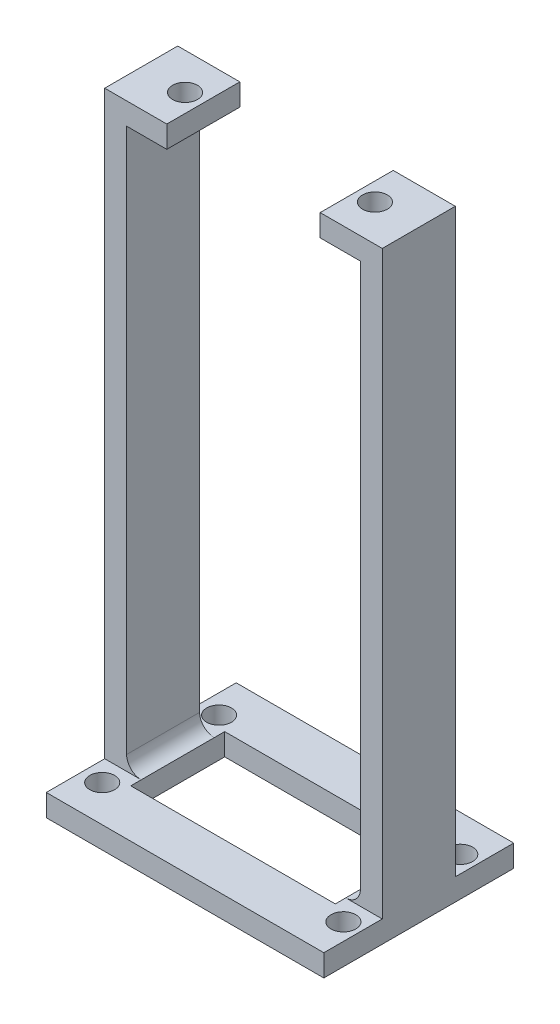
ISO-10303-21;
HEADER;
FILE_DESCRIPTION(('STEP AP214'),'2;1');
FILE_NAME('part.step','',(''),(''),'','','');
FILE_SCHEMA(('AUTOMOTIVE_DESIGN { 1 0 10303 214 1 1 1 1 }'));
ENDSEC;
DATA;
#1=APPLICATION_CONTEXT('core data for automotive mechanical design processes');
#2=APPLICATION_PROTOCOL_DEFINITION('international standard','automotive_design',2000,#1);
#3=PRODUCT_CONTEXT('',#1,'mechanical');
#4=PRODUCT('Part','Part','',(#3));
#5=PRODUCT_RELATED_PRODUCT_CATEGORY('part','',(#4));
#6=PRODUCT_DEFINITION_FORMATION('','',#4);
#7=PRODUCT_DEFINITION_CONTEXT('part definition',#1,'design');
#8=PRODUCT_DEFINITION('design','',#6,#7);
#9=PRODUCT_DEFINITION_SHAPE('','',#8);
#10=(LENGTH_UNIT() NAMED_UNIT(*) SI_UNIT(.MILLI.,.METRE.));
#11=(NAMED_UNIT(*) PLANE_ANGLE_UNIT() SI_UNIT($,.RADIAN.));
#12=(NAMED_UNIT(*) SI_UNIT($,.STERADIAN.) SOLID_ANGLE_UNIT());
#13=UNCERTAINTY_MEASURE_WITH_UNIT(LENGTH_MEASURE(1.E-05),#10,'distance_accuracy_value','');
#14=(GEOMETRIC_REPRESENTATION_CONTEXT(3) GLOBAL_UNCERTAINTY_ASSIGNED_CONTEXT((#13)) GLOBAL_UNIT_ASSIGNED_CONTEXT((#10,
#11,#12)) REPRESENTATION_CONTEXT('',''));
#15=CARTESIAN_POINT('',(0.,0.,0.));
#16=DIRECTION('',(0.,0.,1.));
#17=DIRECTION('',(1.,0.,0.));
#18=AXIS2_PLACEMENT_3D('',#15,#16,#17);
#19=CARTESIAN_POINT('',(-16.,0.,-5.));
#20=DIRECTION('',(0.,1.,0.));
#21=DIRECTION('',(-1.,0.,0.));
#22=AXIS2_PLACEMENT_3D('',#19,#20,#21);
#23=PLANE('',#22);
#24=DIRECTION('',(0.,0.,-1.));
#25=VECTOR('',#24,1.);
#26=CARTESIAN_POINT('',(-14.,0.,6.43055637719667));
#27=LINE('',#26,#25);
#28=CARTESIAN_POINT('',(-14.,0.,6.43055637719667));
#29=VERTEX_POINT('',#28);
#30=CARTESIAN_POINT('',(-14.,0.,5.));
#31=VERTEX_POINT('',#30);
#32=EDGE_CURVE('E207',#29,#31,#27,.T.);
#33=ORIENTED_EDGE('',*,*,#32,.T.);
#34=DIRECTION('',(1.,0.,0.));
#35=VECTOR('',#34,1.);
#36=CARTESIAN_POINT('',(0.,0.,5.));
#37=LINE('',#36,#35);
#38=CARTESIAN_POINT('',(-19.,0.,5.));
#39=VERTEX_POINT('',#38);
#40=EDGE_CURVE('E448',#39,#31,#37,.T.);
#41=ORIENTED_EDGE('',*,*,#40,.F.);
#42=DIRECTION('',(0.,0.,-1.));
#43=VECTOR('',#42,1.);
#44=CARTESIAN_POINT('',(-19.,0.,13.));
#45=LINE('',#44,#43);
#46=CARTESIAN_POINT('',(-19.,0.,13.));
#47=VERTEX_POINT('',#46);
#48=EDGE_CURVE('E305',#47,#39,#45,.T.);
#49=ORIENTED_EDGE('',*,*,#48,.F.);
#50=DIRECTION('',(-1.,0.,0.));
#51=VECTOR('',#50,1.);
#52=CARTESIAN_POINT('',(-19.,0.,13.));
#53=LINE('',#52,#51);
#54=CARTESIAN_POINT('',(19.,0.,13.));
#55=VERTEX_POINT('',#54);
#56=EDGE_CURVE('E299',#55,#47,#53,.T.);
#57=ORIENTED_EDGE('',*,*,#56,.F.);
#58=DIRECTION('',(0.,0.,1.));
#59=VECTOR('',#58,1.);
#60=CARTESIAN_POINT('',(19.,0.,13.));
#61=LINE('',#60,#59);
#62=CARTESIAN_POINT('',(19.,0.,5.));
#63=VERTEX_POINT('',#62);
#64=EDGE_CURVE('E300',#63,#55,#61,.T.);
#65=ORIENTED_EDGE('',*,*,#64,.F.);
#66=CARTESIAN_POINT('',(14.,0.,5.));
#67=VERTEX_POINT('',#66);
#68=EDGE_CURVE('E417',#67,#63,#37,.T.);
#69=ORIENTED_EDGE('',*,*,#68,.F.);
#70=DIRECTION('',(0.,0.,1.));
#71=VECTOR('',#70,1.);
#72=CARTESIAN_POINT('',(14.,0.,6.43055637719668));
#73=LINE('',#72,#71);
#74=CARTESIAN_POINT('',(14.,0.,6.43055637719668));
#75=VERTEX_POINT('',#74);
#76=EDGE_CURVE('E206',#67,#75,#73,.T.);
#77=ORIENTED_EDGE('',*,*,#76,.T.);
#78=DIRECTION('',(-1.,0.,0.));
#79=VECTOR('',#78,1.);
#80=CARTESIAN_POINT('',(14.,0.,6.43055637719668));
#81=LINE('',#80,#79);
#82=EDGE_CURVE('E197',#75,#29,#81,.T.);
#83=ORIENTED_EDGE('',*,*,#82,.T.);
#84=EDGE_LOOP('',(#33,#41,#49,#57,#65,#69,#77,#83));
#85=FACE_BOUND('',#84,.T.);
#86=CARTESIAN_POINT('',(-16.3408584723591,0.,8.00000000000001));
#87=DIRECTION('',(0.,1.,0.));
#88=DIRECTION('',(0.,0.,1.));
#89=AXIS2_PLACEMENT_3D('',#86,#87,#88);
#90=CIRCLE('',#89,1.7);
#91=CARTESIAN_POINT('',(-16.3408584723591,0.,9.7));
#92=VERTEX_POINT('',#91);
#93=EDGE_CURVE('E254',#92,#92,#90,.T.);
#94=ORIENTED_EDGE('',*,*,#93,.F.);
#95=EDGE_LOOP('',(#94));
#96=FACE_BOUND('',#95,.T.);
#97=CARTESIAN_POINT('',(16.6799683758061,0.,8.));
#98=DIRECTION('',(0.,1.,0.));
#99=DIRECTION('',(0.,0.,1.));
#100=AXIS2_PLACEMENT_3D('',#97,#98,#99);
#101=CIRCLE('',#100,1.7);
#102=CARTESIAN_POINT('',(16.6799683758061,0.,9.7));
#103=VERTEX_POINT('',#102);
#104=EDGE_CURVE('E241',#103,#103,#101,.T.);
#105=ORIENTED_EDGE('',*,*,#104,.F.);
#106=EDGE_LOOP('',(#105));
#107=FACE_BOUND('',#106,.T.);
#108=ADVANCED_FACE('F39',(#85,#96,#107),#23,.T.);
#109=CARTESIAN_POINT('',(0.,0.,-5.));
#110=DIRECTION('',(0.,0.,1.));
#111=DIRECTION('',(1.,0.,0.));
#112=AXIS2_PLACEMENT_3D('',#109,#110,#111);
#113=PLANE('',#112);
#114=DIRECTION('',(1.,0.,0.));
#115=VECTOR('',#114,1.);
#116=CARTESIAN_POINT('',(0.,0.,-5.));
#117=LINE('',#116,#115);
#118=CARTESIAN_POINT('',(-19.,0.,-5.));
#119=VERTEX_POINT('',#118);
#120=CARTESIAN_POINT('',(-14.,0.,-5.));
#121=VERTEX_POINT('',#120);
#122=EDGE_CURVE('E212',#119,#121,#117,.T.);
#123=ORIENTED_EDGE('',*,*,#122,.F.);
#124=DIRECTION('',(0.,-1.,0.));
#125=VECTOR('',#124,1.);
#126=CARTESIAN_POINT('',(-19.,79.5,-5.));
#127=LINE('',#126,#125);
#128=CARTESIAN_POINT('',(-19.,79.5,-5.));
#129=VERTEX_POINT('',#128);
#130=EDGE_CURVE('E380',#129,#119,#127,.T.);
#131=ORIENTED_EDGE('',*,*,#130,.F.);
#132=DIRECTION('',(-1.,0.,0.));
#133=VECTOR('',#132,1.);
#134=CARTESIAN_POINT('',(-10.5000000000001,79.5,-5.));
#135=LINE('',#134,#133);
#136=CARTESIAN_POINT('',(-10.5000000000001,79.5,-5.));
#137=VERTEX_POINT('',#136);
#138=EDGE_CURVE('E376',#137,#129,#135,.T.);
#139=ORIENTED_EDGE('',*,*,#138,.F.);
#140=DIRECTION('',(0.,1.,0.));
#141=VECTOR('',#140,1.);
#142=CARTESIAN_POINT('',(-10.5000000000001,79.5,-5.));
#143=LINE('',#142,#141);
#144=CARTESIAN_POINT('',(-10.5000000000001,76.5,-5.));
#145=VERTEX_POINT('',#144);
#146=EDGE_CURVE('E409',#145,#137,#143,.T.);
#147=ORIENTED_EDGE('',*,*,#146,.F.);
#148=DIRECTION('',(1.,0.,0.));
#149=VECTOR('',#148,1.);
#150=CARTESIAN_POINT('',(-10.5000000000001,76.5,-5.));
#151=LINE('',#150,#149);
#152=CARTESIAN_POINT('',(-16.0000000000001,76.5,-5.));
#153=VERTEX_POINT('',#152);
#154=EDGE_CURVE('E405',#153,#145,#151,.T.);
#155=ORIENTED_EDGE('',*,*,#154,.F.);
#156=DIRECTION('',(0.,1.,0.));
#157=VECTOR('',#156,1.);
#158=CARTESIAN_POINT('',(-16.0000000000001,76.5,-5.));
#159=LINE('',#158,#157);
#160=CARTESIAN_POINT('',(-16.,2.,-5.));
#161=VERTEX_POINT('',#160);
#162=EDGE_CURVE('E402',#161,#153,#159,.T.);
#163=ORIENTED_EDGE('',*,*,#162,.F.);
#164=CARTESIAN_POINT('',(-14.,2.,-5.));
#165=DIRECTION('',(0.,0.,1.));
#166=DIRECTION('',(1.,0.,0.));
#167=AXIS2_PLACEMENT_3D('',#164,#165,#166);
#168=CIRCLE('',#167,2.);
#169=EDGE_CURVE('E465',#161,#121,#168,.T.);
#170=ORIENTED_EDGE('',*,*,#169,.T.);
#171=EDGE_LOOP('',(#123,#131,#139,#147,#155,#163,#170));
#172=FACE_BOUND('',#171,.T.);
#173=ADVANCED_FACE('F511',(#172),#113,.F.);
#174=CARTESIAN_POINT('',(14.,0.,-5.));
#175=VERTEX_POINT('',#174);
#176=CARTESIAN_POINT('',(19.,0.,-5.));
#177=VERTEX_POINT('',#176);
#178=EDGE_CURVE('E325',#175,#177,#117,.T.);
#179=ORIENTED_EDGE('',*,*,#178,.F.);
#180=CARTESIAN_POINT('',(14.,2.00000000000001,-5.));
#181=DIRECTION('',(0.,0.,1.));
#182=DIRECTION('',(1.,0.,0.));
#183=AXIS2_PLACEMENT_3D('',#180,#181,#182);
#184=CIRCLE('',#183,2.);
#185=CARTESIAN_POINT('',(16.,2.00000000000001,-5.));
#186=VERTEX_POINT('',#185);
#187=EDGE_CURVE('E11',#175,#186,#184,.T.);
#188=ORIENTED_EDGE('',*,*,#187,.T.);
#189=DIRECTION('',(0.,-1.,0.));
#190=VECTOR('',#189,1.);
#191=CARTESIAN_POINT('',(16.,0.,-5.));
#192=LINE('',#191,#190);
#193=CARTESIAN_POINT('',(16.,76.5,-5.));
#194=VERTEX_POINT('',#193);
#195=EDGE_CURVE('E399',#194,#186,#192,.T.);
#196=ORIENTED_EDGE('',*,*,#195,.F.);
#197=DIRECTION('',(1.,0.,0.));
#198=VECTOR('',#197,1.);
#199=CARTESIAN_POINT('',(16.,76.5,-5.));
#200=LINE('',#199,#198);
#201=CARTESIAN_POINT('',(10.5,76.5,-5.));
#202=VERTEX_POINT('',#201);
#203=EDGE_CURVE('E395',#202,#194,#200,.T.);
#204=ORIENTED_EDGE('',*,*,#203,.F.);
#205=DIRECTION('',(0.,-1.,0.));
#206=VECTOR('',#205,1.);
#207=CARTESIAN_POINT('',(10.5,79.5,-5.));
#208=LINE('',#207,#206);
#209=CARTESIAN_POINT('',(10.5,79.5,-5.));
#210=VERTEX_POINT('',#209);
#211=EDGE_CURVE('E391',#210,#202,#208,.T.);
#212=ORIENTED_EDGE('',*,*,#211,.F.);
#213=DIRECTION('',(-1.,0.,0.));
#214=VECTOR('',#213,1.);
#215=CARTESIAN_POINT('',(19.,79.5,-5.));
#216=LINE('',#215,#214);
#217=CARTESIAN_POINT('',(19.,79.5,-5.));
#218=VERTEX_POINT('',#217);
#219=EDGE_CURVE('E387',#218,#210,#216,.T.);
#220=ORIENTED_EDGE('',*,*,#219,.F.);
#221=DIRECTION('',(0.,1.,0.));
#222=VECTOR('',#221,1.);
#223=CARTESIAN_POINT('',(19.,79.5,-5.));
#224=LINE('',#223,#222);
#225=EDGE_CURVE('E384',#177,#218,#224,.T.);
#226=ORIENTED_EDGE('',*,*,#225,.F.);
#227=EDGE_LOOP('',(#179,#188,#196,#204,#212,#220,#226));
#228=FACE_BOUND('',#227,.T.);
#229=ADVANCED_FACE('F482',(#228),#113,.F.);
#230=CARTESIAN_POINT('',(0.,0.,5.));
#231=DIRECTION('',(0.,0.,1.));
#232=DIRECTION('',(1.,0.,0.));
#233=AXIS2_PLACEMENT_3D('',#230,#231,#232);
#234=PLANE('',#233);
#235=DIRECTION('',(0.,-1.,0.));
#236=VECTOR('',#235,1.);
#237=CARTESIAN_POINT('',(-19.,79.5,5.));
#238=LINE('',#237,#236);
#239=CARTESIAN_POINT('',(-19.,79.5,5.));
#240=VERTEX_POINT('',#239);
#241=EDGE_CURVE('E343',#240,#39,#238,.T.);
#242=ORIENTED_EDGE('',*,*,#241,.T.);
#243=ORIENTED_EDGE('',*,*,#40,.T.);
#244=CARTESIAN_POINT('',(-14.,2.,5.));
#245=DIRECTION('',(0.,0.,1.));
#246=DIRECTION('',(1.,0.,0.));
#247=AXIS2_PLACEMENT_3D('',#244,#245,#246);
#248=CIRCLE('',#247,2.);
#249=CARTESIAN_POINT('',(-16.,2.,5.));
#250=VERTEX_POINT('',#249);
#251=EDGE_CURVE('E462',#31,#250,#248,.F.);
#252=ORIENTED_EDGE('',*,*,#251,.T.);
#253=DIRECTION('',(0.,1.,0.));
#254=VECTOR('',#253,1.);
#255=CARTESIAN_POINT('',(-16.0000000000001,76.5,5.));
#256=LINE('',#255,#254);
#257=CARTESIAN_POINT('',(-16.0000000000001,76.5,5.));
#258=VERTEX_POINT('',#257);
#259=EDGE_CURVE('E365',#250,#258,#256,.T.);
#260=ORIENTED_EDGE('',*,*,#259,.T.);
#261=DIRECTION('',(1.,0.,0.));
#262=VECTOR('',#261,1.);
#263=CARTESIAN_POINT('',(-10.5000000000001,76.5,5.));
#264=LINE('',#263,#262);
#265=CARTESIAN_POINT('',(-10.5000000000001,76.5,5.));
#266=VERTEX_POINT('',#265);
#267=EDGE_CURVE('E368',#258,#266,#264,.T.);
#268=ORIENTED_EDGE('',*,*,#267,.T.);
#269=DIRECTION('',(0.,1.,0.));
#270=VECTOR('',#269,1.);
#271=CARTESIAN_POINT('',(-10.5000000000001,79.5,5.));
#272=LINE('',#271,#270);
#273=CARTESIAN_POINT('',(-10.5000000000001,79.5,5.));
#274=VERTEX_POINT('',#273);
#275=EDGE_CURVE('E372',#266,#274,#272,.T.);
#276=ORIENTED_EDGE('',*,*,#275,.T.);
#277=DIRECTION('',(-1.,0.,0.));
#278=VECTOR('',#277,1.);
#279=CARTESIAN_POINT('',(-10.5000000000001,79.5,5.));
#280=LINE('',#279,#278);
#281=EDGE_CURVE('E339',#274,#240,#280,.T.);
#282=ORIENTED_EDGE('',*,*,#281,.T.);
#283=EDGE_LOOP('',(#242,#243,#252,#260,#268,#276,#282));
#284=FACE_BOUND('',#283,.T.);
#285=ADVANCED_FACE('F532',(#284),#234,.T.);
#286=DIRECTION('',(0.,-1.,0.));
#287=VECTOR('',#286,1.);
#288=CARTESIAN_POINT('',(16.,0.,5.));
#289=LINE('',#288,#287);
#290=CARTESIAN_POINT('',(16.,76.5,5.));
#291=VERTEX_POINT('',#290);
#292=CARTESIAN_POINT('',(16.,2.00000000000001,5.));
#293=VERTEX_POINT('',#292);
#294=EDGE_CURVE('E361',#291,#293,#289,.T.);
#295=ORIENTED_EDGE('',*,*,#294,.T.);
#296=CARTESIAN_POINT('',(14.,2.00000000000001,5.));
#297=DIRECTION('',(0.,0.,1.));
#298=DIRECTION('',(1.,0.,0.));
#299=AXIS2_PLACEMENT_3D('',#296,#297,#298);
#300=CIRCLE('',#299,2.);
#301=EDGE_CURVE('E48',#293,#67,#300,.F.);
#302=ORIENTED_EDGE('',*,*,#301,.T.);
#303=ORIENTED_EDGE('',*,*,#68,.T.);
#304=DIRECTION('',(0.,1.,0.));
#305=VECTOR('',#304,1.);
#306=CARTESIAN_POINT('',(19.,79.5,5.));
#307=LINE('',#306,#305);
#308=CARTESIAN_POINT('',(19.,79.5,5.));
#309=VERTEX_POINT('',#308);
#310=EDGE_CURVE('E346',#63,#309,#307,.T.);
#311=ORIENTED_EDGE('',*,*,#310,.T.);
#312=DIRECTION('',(-1.,0.,0.));
#313=VECTOR('',#312,1.);
#314=CARTESIAN_POINT('',(19.,79.5,5.));
#315=LINE('',#314,#313);
#316=CARTESIAN_POINT('',(10.5,79.5,5.));
#317=VERTEX_POINT('',#316);
#318=EDGE_CURVE('E349',#309,#317,#315,.T.);
#319=ORIENTED_EDGE('',*,*,#318,.T.);
#320=DIRECTION('',(0.,-1.,0.));
#321=VECTOR('',#320,1.);
#322=CARTESIAN_POINT('',(10.5,79.5,5.));
#323=LINE('',#322,#321);
#324=CARTESIAN_POINT('',(10.5,76.5,5.));
#325=VERTEX_POINT('',#324);
#326=EDGE_CURVE('E353',#317,#325,#323,.T.);
#327=ORIENTED_EDGE('',*,*,#326,.T.);
#328=DIRECTION('',(1.,0.,0.));
#329=VECTOR('',#328,1.);
#330=CARTESIAN_POINT('',(16.,76.5,5.));
#331=LINE('',#330,#329);
#332=EDGE_CURVE('E357',#325,#291,#331,.T.);
#333=ORIENTED_EDGE('',*,*,#332,.T.);
#334=EDGE_LOOP('',(#295,#302,#303,#311,#319,#327,#333));
#335=FACE_BOUND('',#334,.T.);
#336=ADVANCED_FACE('F471',(#335),#234,.T.);
#337=CARTESIAN_POINT('',(-10.5000000000001,79.5,-5.));
#338=DIRECTION('',(0.,1.,0.));
#339=DIRECTION('',(0.,0.,1.));
#340=AXIS2_PLACEMENT_3D('',#337,#338,#339);
#341=PLANE('',#340);
#342=CARTESIAN_POINT('',(-12.9999999999996,79.5,1.80411241501588E-13));
#343=DIRECTION('',(0.,1.,0.));
#344=DIRECTION('',(0.,0.,1.));
#345=AXIS2_PLACEMENT_3D('',#342,#343,#344);
#346=CIRCLE('',#345,1.69999999999999);
#347=CARTESIAN_POINT('',(-12.9999999999996,79.5,1.70000000000017));
#348=VERTEX_POINT('',#347);
#349=EDGE_CURVE('E278',#348,#348,#346,.T.);
#350=ORIENTED_EDGE('',*,*,#349,.F.);
#351=EDGE_LOOP('',(#350));
#352=FACE_BOUND('',#351,.T.);
#353=DIRECTION('',(0.,0.,1.));
#354=VECTOR('',#353,1.);
#355=CARTESIAN_POINT('',(-19.,79.5,-5.));
#356=LINE('',#355,#354);
#357=EDGE_CURVE('E413',#129,#240,#356,.T.);
#358=ORIENTED_EDGE('',*,*,#357,.T.);
#359=ORIENTED_EDGE('',*,*,#281,.F.);
#360=DIRECTION('',(0.,0.,1.));
#361=VECTOR('',#360,1.);
#362=CARTESIAN_POINT('',(-10.5000000000001,79.5,-5.));
#363=LINE('',#362,#361);
#364=EDGE_CURVE('E414',#137,#274,#363,.T.);
#365=ORIENTED_EDGE('',*,*,#364,.F.);
#366=ORIENTED_EDGE('',*,*,#138,.T.);
#367=EDGE_LOOP('',(#358,#359,#365,#366));
#368=FACE_BOUND('',#367,.T.);
#369=ADVANCED_FACE('F529',(#352,#368),#341,.T.);
#370=CARTESIAN_POINT('',(-10.5000000000001,79.5,-5.));
#371=DIRECTION('',(1.,0.,0.));
#372=DIRECTION('',(0.,0.,-1.));
#373=AXIS2_PLACEMENT_3D('',#370,#371,#372);
#374=PLANE('',#373);
#375=ORIENTED_EDGE('',*,*,#364,.T.);
#376=ORIENTED_EDGE('',*,*,#275,.F.);
#377=DIRECTION('',(0.,0.,1.));
#378=VECTOR('',#377,1.);
#379=CARTESIAN_POINT('',(-10.5000000000001,76.5,-5.));
#380=LINE('',#379,#378);
#381=EDGE_CURVE('E418',#145,#266,#380,.T.);
#382=ORIENTED_EDGE('',*,*,#381,.F.);
#383=ORIENTED_EDGE('',*,*,#146,.T.);
#384=EDGE_LOOP('',(#375,#376,#382,#383));
#385=FACE_BOUND('',#384,.T.);
#386=ADVANCED_FACE('F526',(#385),#374,.T.);
#387=CARTESIAN_POINT('',(-10.5000000000001,76.5,-5.));
#388=DIRECTION('',(0.,-1.,0.));
#389=DIRECTION('',(0.,0.,-1.));
#390=AXIS2_PLACEMENT_3D('',#387,#388,#389);
#391=PLANE('',#390);
#392=CARTESIAN_POINT('',(-12.9999999999996,76.5,1.80411241501588E-13));
#393=DIRECTION('',(0.,-1.,0.));
#394=DIRECTION('',(0.,0.,-1.));
#395=AXIS2_PLACEMENT_3D('',#392,#393,#394);
#396=CIRCLE('',#395,1.69999999999999);
#397=CARTESIAN_POINT('',(-12.9999999999996,76.5,-1.69999999999981));
#398=VERTEX_POINT('',#397);
#399=EDGE_CURVE('E282',#398,#398,#396,.T.);
#400=ORIENTED_EDGE('',*,*,#399,.F.);
#401=EDGE_LOOP('',(#400));
#402=FACE_BOUND('',#401,.T.);
#403=ORIENTED_EDGE('',*,*,#381,.T.);
#404=ORIENTED_EDGE('',*,*,#267,.F.);
#405=DIRECTION('',(0.,0.,1.));
#406=VECTOR('',#405,1.);
#407=CARTESIAN_POINT('',(-16.0000000000001,76.5,-5.));
#408=LINE('',#407,#406);
#409=EDGE_CURVE('E421',#153,#258,#408,.T.);
#410=ORIENTED_EDGE('',*,*,#409,.F.);
#411=ORIENTED_EDGE('',*,*,#154,.T.);
#412=EDGE_LOOP('',(#403,#404,#410,#411));
#413=FACE_BOUND('',#412,.T.);
#414=ADVANCED_FACE('F522',(#402,#413),#391,.T.);
#415=CARTESIAN_POINT('',(-16.0000000000001,76.5,-5.));
#416=DIRECTION('',(1.,0.,0.));
#417=DIRECTION('',(0.,1.,0.));
#418=AXIS2_PLACEMENT_3D('',#415,#416,#417);
#419=PLANE('',#418);
#420=ORIENTED_EDGE('',*,*,#259,.F.);
#421=DIRECTION('',(0.,0.,1.));
#422=VECTOR('',#421,1.);
#423=CARTESIAN_POINT('',(-16.,2.,-5.));
#424=LINE('',#423,#422);
#425=EDGE_CURVE('E455',#250,#161,#424,.F.);
#426=ORIENTED_EDGE('',*,*,#425,.T.);
#427=ORIENTED_EDGE('',*,*,#162,.T.);
#428=ORIENTED_EDGE('',*,*,#409,.T.);
#429=EDGE_LOOP('',(#420,#426,#427,#428));
#430=FACE_BOUND('',#429,.T.);
#431=ADVANCED_FACE('F508',(#430),#419,.T.);
#432=CARTESIAN_POINT('',(-14.,0.,-6.43055637719669));
#433=VERTEX_POINT('',#432);
#434=EDGE_CURVE('E190',#121,#433,#27,.T.);
#435=ORIENTED_EDGE('',*,*,#434,.T.);
#436=DIRECTION('',(1.,0.,0.));
#437=VECTOR('',#436,1.);
#438=CARTESIAN_POINT('',(14.,0.,-6.43055637719668));
#439=LINE('',#438,#437);
#440=CARTESIAN_POINT('',(14.,0.,-6.43055637719668));
#441=VERTEX_POINT('',#440);
#442=EDGE_CURVE('E200',#433,#441,#439,.T.);
#443=ORIENTED_EDGE('',*,*,#442,.T.);
#444=EDGE_CURVE('E224',#441,#175,#73,.T.);
#445=ORIENTED_EDGE('',*,*,#444,.T.);
#446=ORIENTED_EDGE('',*,*,#178,.T.);
#447=CARTESIAN_POINT('',(19.,0.,-13.));
#448=VERTEX_POINT('',#447);
#449=EDGE_CURVE('E295',#448,#177,#61,.T.);
#450=ORIENTED_EDGE('',*,*,#449,.F.);
#451=DIRECTION('',(1.,0.,0.));
#452=VECTOR('',#451,1.);
#453=CARTESIAN_POINT('',(-19.,0.,-13.));
#454=LINE('',#453,#452);
#455=CARTESIAN_POINT('',(-19.,0.,-13.));
#456=VERTEX_POINT('',#455);
#457=EDGE_CURVE('E309',#456,#448,#454,.T.);
#458=ORIENTED_EDGE('',*,*,#457,.F.);
#459=EDGE_CURVE('E304',#119,#456,#45,.T.);
#460=ORIENTED_EDGE('',*,*,#459,.F.);
#461=ORIENTED_EDGE('',*,*,#122,.T.);
#462=EDGE_LOOP('',(#435,#443,#445,#446,#450,#458,#460,#461));
#463=FACE_BOUND('',#462,.T.);
#464=CARTESIAN_POINT('',(16.6799683758061,0.,-8.));
#465=DIRECTION('',(0.,1.,0.));
#466=DIRECTION('',(0.,0.,1.));
#467=AXIS2_PLACEMENT_3D('',#464,#465,#466);
#468=CIRCLE('',#467,1.7);
#469=CARTESIAN_POINT('',(16.6799683758061,0.,-6.3));
#470=VERTEX_POINT('',#469);
#471=EDGE_CURVE('E262',#470,#470,#468,.T.);
#472=ORIENTED_EDGE('',*,*,#471,.F.);
#473=EDGE_LOOP('',(#472));
#474=FACE_BOUND('',#473,.T.);
#475=CARTESIAN_POINT('',(-16.3408584723591,0.,-7.99999999999999));
#476=DIRECTION('',(0.,1.,0.));
#477=DIRECTION('',(0.,0.,1.));
#478=AXIS2_PLACEMENT_3D('',#475,#476,#477);
#479=CIRCLE('',#478,1.7);
#480=CARTESIAN_POINT('',(-16.3408584723591,0.,-6.3));
#481=VERTEX_POINT('',#480);
#482=EDGE_CURVE('E270',#481,#481,#479,.T.);
#483=ORIENTED_EDGE('',*,*,#482,.F.);
#484=EDGE_LOOP('',(#483));
#485=FACE_BOUND('',#484,.T.);
#486=ADVANCED_FACE('F209',(#463,#474,#485),#23,.T.);
#487=CARTESIAN_POINT('',(16.,0.,-5.));
#488=DIRECTION('',(-1.,0.,0.));
#489=DIRECTION('',(0.,-1.,0.));
#490=AXIS2_PLACEMENT_3D('',#487,#488,#489);
#491=PLANE('',#490);
#492=ORIENTED_EDGE('',*,*,#195,.T.);
#493=DIRECTION('',(0.,0.,1.));
#494=VECTOR('',#493,1.);
#495=CARTESIAN_POINT('',(16.,2.00000000000001,5.));
#496=LINE('',#495,#494);
#497=EDGE_CURVE('E458',#186,#293,#496,.T.);
#498=ORIENTED_EDGE('',*,*,#497,.T.);
#499=ORIENTED_EDGE('',*,*,#294,.F.);
#500=DIRECTION('',(0.,0.,1.));
#501=VECTOR('',#500,1.);
#502=CARTESIAN_POINT('',(16.,76.5,-5.));
#503=LINE('',#502,#501);
#504=EDGE_CURVE('E425',#194,#291,#503,.T.);
#505=ORIENTED_EDGE('',*,*,#504,.F.);
#506=EDGE_LOOP('',(#492,#498,#499,#505));
#507=FACE_BOUND('',#506,.T.);
#508=ADVANCED_FACE('F499',(#507),#491,.T.);
#509=CARTESIAN_POINT('',(16.,76.5,-5.));
#510=DIRECTION('',(0.,-1.,0.));
#511=DIRECTION('',(1.,0.,0.));
#512=AXIS2_PLACEMENT_3D('',#509,#510,#511);
#513=PLANE('',#512);
#514=CARTESIAN_POINT('',(13.0000000000004,76.5,1.80411241501588E-13));
#515=DIRECTION('',(0.,-1.,0.));
#516=DIRECTION('',(1.,0.,0.));
#517=AXIS2_PLACEMENT_3D('',#514,#515,#516);
#518=CIRCLE('',#517,1.69999999999999);
#519=CARTESIAN_POINT('',(14.7000000000004,76.5,1.80411241501588E-13));
#520=VERTEX_POINT('',#519);
#521=EDGE_CURVE('E290',#520,#520,#518,.T.);
#522=ORIENTED_EDGE('',*,*,#521,.F.);
#523=EDGE_LOOP('',(#522));
#524=FACE_BOUND('',#523,.T.);
#525=ORIENTED_EDGE('',*,*,#504,.T.);
#526=ORIENTED_EDGE('',*,*,#332,.F.);
#527=DIRECTION('',(0.,0.,1.));
#528=VECTOR('',#527,1.);
#529=CARTESIAN_POINT('',(10.5,76.5,-5.));
#530=LINE('',#529,#528);
#531=EDGE_CURVE('E428',#202,#325,#530,.T.);
#532=ORIENTED_EDGE('',*,*,#531,.F.);
#533=ORIENTED_EDGE('',*,*,#203,.T.);
#534=EDGE_LOOP('',(#525,#526,#532,#533));
#535=FACE_BOUND('',#534,.T.);
#536=ADVANCED_FACE('F497',(#524,#535),#513,.T.);
#537=CARTESIAN_POINT('',(10.5,79.5,-5.));
#538=DIRECTION('',(-1.,0.,0.));
#539=DIRECTION('',(0.,0.,1.));
#540=AXIS2_PLACEMENT_3D('',#537,#538,#539);
#541=PLANE('',#540);
#542=ORIENTED_EDGE('',*,*,#531,.T.);
#543=ORIENTED_EDGE('',*,*,#326,.F.);
#544=DIRECTION('',(0.,0.,1.));
#545=VECTOR('',#544,1.);
#546=CARTESIAN_POINT('',(10.5,79.5,-5.));
#547=LINE('',#546,#545);
#548=EDGE_CURVE('E431',#210,#317,#547,.T.);
#549=ORIENTED_EDGE('',*,*,#548,.F.);
#550=ORIENTED_EDGE('',*,*,#211,.T.);
#551=EDGE_LOOP('',(#542,#543,#549,#550));
#552=FACE_BOUND('',#551,.T.);
#553=ADVANCED_FACE('F494',(#552),#541,.T.);
#554=CARTESIAN_POINT('',(19.,79.5,-5.));
#555=DIRECTION('',(0.,1.,0.));
#556=DIRECTION('',(0.,0.,1.));
#557=AXIS2_PLACEMENT_3D('',#554,#555,#556);
#558=PLANE('',#557);
#559=CARTESIAN_POINT('',(13.0000000000004,79.5,1.80411241501588E-13));
#560=DIRECTION('',(0.,1.,0.));
#561=DIRECTION('',(0.,0.,1.));
#562=AXIS2_PLACEMENT_3D('',#559,#560,#561);
#563=CIRCLE('',#562,1.69999999999999);
#564=CARTESIAN_POINT('',(13.0000000000004,79.5,1.70000000000017));
#565=VERTEX_POINT('',#564);
#566=EDGE_CURVE('E286',#565,#565,#563,.T.);
#567=ORIENTED_EDGE('',*,*,#566,.F.);
#568=EDGE_LOOP('',(#567));
#569=FACE_BOUND('',#568,.T.);
#570=ORIENTED_EDGE('',*,*,#548,.T.);
#571=ORIENTED_EDGE('',*,*,#318,.F.);
#572=DIRECTION('',(0.,0.,1.));
#573=VECTOR('',#572,1.);
#574=CARTESIAN_POINT('',(19.,79.5,-5.));
#575=LINE('',#574,#573);
#576=EDGE_CURVE('E434',#218,#309,#575,.T.);
#577=ORIENTED_EDGE('',*,*,#576,.F.);
#578=ORIENTED_EDGE('',*,*,#219,.T.);
#579=EDGE_LOOP('',(#570,#571,#577,#578));
#580=FACE_BOUND('',#579,.T.);
#581=ADVANCED_FACE('F490',(#569,#580),#558,.T.);
#582=CARTESIAN_POINT('',(19.,79.5,-5.));
#583=DIRECTION('',(1.,0.,0.));
#584=DIRECTION('',(0.,1.,0.));
#585=AXIS2_PLACEMENT_3D('',#582,#583,#584);
#586=PLANE('',#585);
#587=ORIENTED_EDGE('',*,*,#449,.T.);
#588=ORIENTED_EDGE('',*,*,#225,.T.);
#589=ORIENTED_EDGE('',*,*,#576,.T.);
#590=ORIENTED_EDGE('',*,*,#310,.F.);
#591=ORIENTED_EDGE('',*,*,#64,.T.);
#592=DIRECTION('',(0.,-1.,0.));
#593=VECTOR('',#592,1.);
#594=CARTESIAN_POINT('',(19.,0.,13.));
#595=LINE('',#594,#593);
#596=CARTESIAN_POINT('',(19.,-3.00000000000001,13.));
#597=VERTEX_POINT('',#596);
#598=EDGE_CURVE('E313',#55,#597,#595,.T.);
#599=ORIENTED_EDGE('',*,*,#598,.T.);
#600=DIRECTION('',(0.,0.,1.));
#601=VECTOR('',#600,1.);
#602=CARTESIAN_POINT('',(19.,-3.00000000000001,-5.));
#603=LINE('',#602,#601);
#604=CARTESIAN_POINT('',(19.,-3.00000000000001,-13.));
#605=VERTEX_POINT('',#604);
#606=EDGE_CURVE('E438',#605,#597,#603,.T.);
#607=ORIENTED_EDGE('',*,*,#606,.F.);
#608=DIRECTION('',(0.,-1.,0.));
#609=VECTOR('',#608,1.);
#610=CARTESIAN_POINT('',(19.,0.,-13.));
#611=LINE('',#610,#609);
#612=EDGE_CURVE('E321',#448,#605,#611,.T.);
#613=ORIENTED_EDGE('',*,*,#612,.F.);
#614=EDGE_LOOP('',(#587,#588,#589,#590,#591,#599,#607,#613));
#615=FACE_BOUND('',#614,.T.);
#616=ADVANCED_FACE('F487',(#615),#586,.T.);
#617=CARTESIAN_POINT('',(19.,-3.00000000000001,-5.));
#618=DIRECTION('',(0.,-1.,0.));
#619=DIRECTION('',(1.,0.,0.));
#620=AXIS2_PLACEMENT_3D('',#617,#618,#619);
#621=PLANE('',#620);
#622=DIRECTION('',(0.,0.,-1.));
#623=VECTOR('',#622,1.);
#624=CARTESIAN_POINT('',(-14.,-3.00000000000002,6.43055637719667));
#625=LINE('',#624,#623);
#626=CARTESIAN_POINT('',(-14.,-3.00000000000002,6.43055637719667));
#627=VERTEX_POINT('',#626);
#628=CARTESIAN_POINT('',(-14.,-3.00000000000002,-6.43055637719669));
#629=VERTEX_POINT('',#628);
#630=EDGE_CURVE('E55',#627,#629,#625,.T.);
#631=ORIENTED_EDGE('',*,*,#630,.F.);
#632=DIRECTION('',(-1.,0.,0.));
#633=VECTOR('',#632,1.);
#634=CARTESIAN_POINT('',(14.,-3.00000000000001,6.43055637719668));
#635=LINE('',#634,#633);
#636=CARTESIAN_POINT('',(14.,-3.00000000000001,6.43055637719668));
#637=VERTEX_POINT('',#636);
#638=EDGE_CURVE('E215',#637,#627,#635,.T.);
#639=ORIENTED_EDGE('',*,*,#638,.F.);
#640=DIRECTION('',(0.,0.,1.));
#641=VECTOR('',#640,1.);
#642=CARTESIAN_POINT('',(14.,-3.00000000000001,6.43055637719668));
#643=LINE('',#642,#641);
#644=CARTESIAN_POINT('',(14.,-3.00000000000001,-6.43055637719668));
#645=VERTEX_POINT('',#644);
#646=EDGE_CURVE('E221',#645,#637,#643,.T.);
#647=ORIENTED_EDGE('',*,*,#646,.F.);
#648=DIRECTION('',(1.,0.,0.));
#649=VECTOR('',#648,1.);
#650=CARTESIAN_POINT('',(14.,-3.00000000000001,-6.43055637719668));
#651=LINE('',#650,#649);
#652=EDGE_CURVE('E232',#629,#645,#651,.T.);
#653=ORIENTED_EDGE('',*,*,#652,.F.);
#654=EDGE_LOOP('',(#631,#639,#647,#653));
#655=FACE_BOUND('',#654,.T.);
#656=CARTESIAN_POINT('',(16.6799683758061,-3.00000000000001,8.));
#657=DIRECTION('',(0.,-1.,0.));
#658=DIRECTION('',(1.,0.,0.));
#659=AXIS2_PLACEMENT_3D('',#656,#657,#658);
#660=CIRCLE('',#659,1.7);
#661=CARTESIAN_POINT('',(18.3799683758061,-3.00000000000001,8.));
#662=VERTEX_POINT('',#661);
#663=EDGE_CURVE('E250',#662,#662,#660,.T.);
#664=ORIENTED_EDGE('',*,*,#663,.F.);
#665=EDGE_LOOP('',(#664));
#666=FACE_BOUND('',#665,.T.);
#667=CARTESIAN_POINT('',(-16.3408584723591,-3.00000000000002,8.00000000000001));
#668=DIRECTION('',(0.,-1.,0.));
#669=DIRECTION('',(1.,0.,0.));
#670=AXIS2_PLACEMENT_3D('',#667,#668,#669);
#671=CIRCLE('',#670,1.7);
#672=CARTESIAN_POINT('',(-14.6408584723591,-3.00000000000002,8.00000000000001));
#673=VERTEX_POINT('',#672);
#674=EDGE_CURVE('E258',#673,#673,#671,.T.);
#675=ORIENTED_EDGE('',*,*,#674,.F.);
#676=EDGE_LOOP('',(#675));
#677=FACE_BOUND('',#676,.T.);
#678=CARTESIAN_POINT('',(16.6799683758061,-3.00000000000001,-8.));
#679=DIRECTION('',(0.,-1.,0.));
#680=DIRECTION('',(1.,0.,0.));
#681=AXIS2_PLACEMENT_3D('',#678,#679,#680);
#682=CIRCLE('',#681,1.7);
#683=CARTESIAN_POINT('',(18.3799683758061,-3.00000000000001,-8.));
#684=VERTEX_POINT('',#683);
#685=EDGE_CURVE('E266',#684,#684,#682,.T.);
#686=ORIENTED_EDGE('',*,*,#685,.F.);
#687=EDGE_LOOP('',(#686));
#688=FACE_BOUND('',#687,.T.);
#689=CARTESIAN_POINT('',(-16.3408584723591,-3.00000000000002,-7.99999999999999));
#690=DIRECTION('',(0.,-1.,0.));
#691=DIRECTION('',(1.,0.,0.));
#692=AXIS2_PLACEMENT_3D('',#689,#690,#691);
#693=CIRCLE('',#692,1.7);
#694=CARTESIAN_POINT('',(-14.6408584723591,-3.00000000000002,-7.99999999999999));
#695=VERTEX_POINT('',#694);
#696=EDGE_CURVE('E274',#695,#695,#693,.T.);
#697=ORIENTED_EDGE('',*,*,#696,.F.);
#698=EDGE_LOOP('',(#697));
#699=FACE_BOUND('',#698,.T.);
#700=ORIENTED_EDGE('',*,*,#606,.T.);
#701=DIRECTION('',(-1.,0.,0.));
#702=VECTOR('',#701,1.);
#703=CARTESIAN_POINT('',(-19.,-3.00000000000002,13.));
#704=LINE('',#703,#702);
#705=CARTESIAN_POINT('',(-19.,-3.00000000000002,13.));
#706=VERTEX_POINT('',#705);
#707=EDGE_CURVE('E294',#597,#706,#704,.T.);
#708=ORIENTED_EDGE('',*,*,#707,.T.);
#709=DIRECTION('',(0.,0.,1.));
#710=VECTOR('',#709,1.);
#711=CARTESIAN_POINT('',(-19.,-3.00000000000002,-5.));
#712=LINE('',#711,#710);
#713=CARTESIAN_POINT('',(-19.,-3.00000000000002,-13.));
#714=VERTEX_POINT('',#713);
#715=EDGE_CURVE('E441',#714,#706,#712,.T.);
#716=ORIENTED_EDGE('',*,*,#715,.F.);
#717=DIRECTION('',(1.,0.,0.));
#718=VECTOR('',#717,1.);
#719=CARTESIAN_POINT('',(-19.,-3.00000000000002,-13.));
#720=LINE('',#719,#718);
#721=EDGE_CURVE('E317',#714,#605,#720,.T.);
#722=ORIENTED_EDGE('',*,*,#721,.T.);
#723=EDGE_LOOP('',(#700,#708,#716,#722));
#724=FACE_BOUND('',#723,.T.);
#725=ADVANCED_FACE('F586',(#655,#666,#677,#688,#699,#724),#621,.T.);
#726=CARTESIAN_POINT('',(-19.,44.5833333333333,-5.));
#727=DIRECTION('',(-1.,0.,0.));
#728=DIRECTION('',(0.,-1.,0.));
#729=AXIS2_PLACEMENT_3D('',#726,#727,#728);
#730=PLANE('',#729);
#731=ORIENTED_EDGE('',*,*,#48,.T.);
#732=ORIENTED_EDGE('',*,*,#241,.F.);
#733=ORIENTED_EDGE('',*,*,#357,.F.);
#734=ORIENTED_EDGE('',*,*,#130,.T.);
#735=ORIENTED_EDGE('',*,*,#459,.T.);
#736=DIRECTION('',(0.,-1.,0.));
#737=VECTOR('',#736,1.);
#738=CARTESIAN_POINT('',(-19.,0.,-13.));
#739=LINE('',#738,#737);
#740=EDGE_CURVE('E326',#456,#714,#739,.T.);
#741=ORIENTED_EDGE('',*,*,#740,.T.);
#742=ORIENTED_EDGE('',*,*,#715,.T.);
#743=DIRECTION('',(0.,-1.,0.));
#744=VECTOR('',#743,1.);
#745=CARTESIAN_POINT('',(-19.,0.,13.));
#746=LINE('',#745,#744);
#747=EDGE_CURVE('E330',#47,#706,#746,.T.);
#748=ORIENTED_EDGE('',*,*,#747,.F.);
#749=EDGE_LOOP('',(#731,#732,#733,#734,#735,#741,#742,#748));
#750=FACE_BOUND('',#749,.T.);
#751=ADVANCED_FACE('F540',(#750),#730,.T.);
#752=CARTESIAN_POINT('',(-19.,0.,13.));
#753=DIRECTION('',(0.,0.,1.));
#754=DIRECTION('',(1.,0.,0.));
#755=AXIS2_PLACEMENT_3D('',#752,#753,#754);
#756=PLANE('',#755);
#757=ORIENTED_EDGE('',*,*,#707,.F.);
#758=ORIENTED_EDGE('',*,*,#598,.F.);
#759=ORIENTED_EDGE('',*,*,#56,.T.);
#760=ORIENTED_EDGE('',*,*,#747,.T.);
#761=EDGE_LOOP('',(#757,#758,#759,#760));
#762=FACE_BOUND('',#761,.T.);
#763=ADVANCED_FACE('F536',(#762),#756,.T.);
#764=CARTESIAN_POINT('',(-19.,0.,-13.));
#765=DIRECTION('',(0.,0.,-1.));
#766=DIRECTION('',(-1.,0.,0.));
#767=AXIS2_PLACEMENT_3D('',#764,#765,#766);
#768=PLANE('',#767);
#769=ORIENTED_EDGE('',*,*,#721,.F.);
#770=ORIENTED_EDGE('',*,*,#740,.F.);
#771=ORIENTED_EDGE('',*,*,#457,.T.);
#772=ORIENTED_EDGE('',*,*,#612,.T.);
#773=EDGE_LOOP('',(#769,#770,#771,#772));
#774=FACE_BOUND('',#773,.T.);
#775=ADVANCED_FACE('F539',(#774),#768,.T.);
#776=CARTESIAN_POINT('',(13.0000000000004,79.5,1.80411241501588E-13));
#777=DIRECTION('',(0.,1.,0.));
#778=DIRECTION('',(0.,0.,1.));
#779=AXIS2_PLACEMENT_3D('',#776,#777,#778);
#780=CYLINDRICAL_SURFACE('',#779,1.69999999999999);
#781=ORIENTED_EDGE('',*,*,#566,.T.);
#782=EDGE_LOOP('',(#781));
#783=FACE_BOUND('',#782,.T.);
#784=ORIENTED_EDGE('',*,*,#521,.T.);
#785=EDGE_LOOP('',(#784));
#786=FACE_BOUND('',#785,.T.);
#787=ADVANCED_FACE('F544',(#783,#786),#780,.F.);
#788=CARTESIAN_POINT('',(-12.9999999999996,79.5,1.80411241501588E-13));
#789=DIRECTION('',(0.,1.,0.));
#790=DIRECTION('',(0.,0.,1.));
#791=AXIS2_PLACEMENT_3D('',#788,#789,#790);
#792=CYLINDRICAL_SURFACE('',#791,1.69999999999999);
#793=ORIENTED_EDGE('',*,*,#349,.T.);
#794=EDGE_LOOP('',(#793));
#795=FACE_BOUND('',#794,.T.);
#796=ORIENTED_EDGE('',*,*,#399,.T.);
#797=EDGE_LOOP('',(#796));
#798=FACE_BOUND('',#797,.T.);
#799=ADVANCED_FACE('F548',(#795,#798),#792,.F.);
#800=CARTESIAN_POINT('',(-14.,2.,-5.));
#801=DIRECTION('',(0.,0.,-1.));
#802=DIRECTION('',(-1.,0.,0.));
#803=AXIS2_PLACEMENT_3D('',#800,#801,#802);
#804=CYLINDRICAL_SURFACE('',#803,2.);
#805=ORIENTED_EDGE('',*,*,#169,.F.);
#806=ORIENTED_EDGE('',*,*,#425,.F.);
#807=ORIENTED_EDGE('',*,*,#251,.F.);
#808=DIRECTION('',(0.,0.,1.));
#809=VECTOR('',#808,1.);
#810=CARTESIAN_POINT('',(-14.,0.,5.));
#811=LINE('',#810,#809);
#812=EDGE_CURVE('E452',#121,#31,#811,.T.);
#813=ORIENTED_EDGE('',*,*,#812,.F.);
#814=EDGE_LOOP('',(#805,#806,#807,#813));
#815=FACE_BOUND('',#814,.T.);
#816=ADVANCED_FACE('F552',(#815),#804,.F.);
#817=CARTESIAN_POINT('',(14.,2.00000000000001,-5.));
#818=DIRECTION('',(0.,0.,-1.));
#819=DIRECTION('',(-1.,0.,0.));
#820=AXIS2_PLACEMENT_3D('',#817,#818,#819);
#821=CYLINDRICAL_SURFACE('',#820,2.);
#822=ORIENTED_EDGE('',*,*,#187,.F.);
#823=DIRECTION('',(0.,0.,1.));
#824=VECTOR('',#823,1.);
#825=CARTESIAN_POINT('',(14.,0.,-5.));
#826=LINE('',#825,#824);
#827=EDGE_CURVE('E449',#67,#175,#826,.F.);
#828=ORIENTED_EDGE('',*,*,#827,.F.);
#829=ORIENTED_EDGE('',*,*,#301,.F.);
#830=ORIENTED_EDGE('',*,*,#497,.F.);
#831=EDGE_LOOP('',(#822,#828,#829,#830));
#832=FACE_BOUND('',#831,.T.);
#833=ADVANCED_FACE('F41',(#832),#821,.F.);
#834=CARTESIAN_POINT('',(-16.3408584723591,0.,-7.99999999999999));
#835=DIRECTION('',(0.,1.,0.));
#836=DIRECTION('',(0.,0.,1.));
#837=AXIS2_PLACEMENT_3D('',#834,#835,#836);
#838=CYLINDRICAL_SURFACE('',#837,1.7);
#839=ORIENTED_EDGE('',*,*,#696,.T.);
#840=EDGE_LOOP('',(#839));
#841=FACE_BOUND('',#840,.T.);
#842=ORIENTED_EDGE('',*,*,#482,.T.);
#843=EDGE_LOOP('',(#842));
#844=FACE_BOUND('',#843,.T.);
#845=ADVANCED_FACE('F554',(#841,#844),#838,.F.);
#846=CARTESIAN_POINT('',(16.6799683758061,0.,-8.));
#847=DIRECTION('',(0.,1.,0.));
#848=DIRECTION('',(0.,0.,1.));
#849=AXIS2_PLACEMENT_3D('',#846,#847,#848);
#850=CYLINDRICAL_SURFACE('',#849,1.7);
#851=ORIENTED_EDGE('',*,*,#685,.T.);
#852=EDGE_LOOP('',(#851));
#853=FACE_BOUND('',#852,.T.);
#854=ORIENTED_EDGE('',*,*,#471,.T.);
#855=EDGE_LOOP('',(#854));
#856=FACE_BOUND('',#855,.T.);
#857=ADVANCED_FACE('F557',(#853,#856),#850,.F.);
#858=CARTESIAN_POINT('',(-16.3408584723591,0.,8.00000000000001));
#859=DIRECTION('',(0.,1.,0.));
#860=DIRECTION('',(0.,0.,1.));
#861=AXIS2_PLACEMENT_3D('',#858,#859,#860);
#862=CYLINDRICAL_SURFACE('',#861,1.7);
#863=ORIENTED_EDGE('',*,*,#674,.T.);
#864=EDGE_LOOP('',(#863));
#865=FACE_BOUND('',#864,.T.);
#866=ORIENTED_EDGE('',*,*,#93,.T.);
#867=EDGE_LOOP('',(#866));
#868=FACE_BOUND('',#867,.T.);
#869=ADVANCED_FACE('F561',(#865,#868),#862,.F.);
#870=CARTESIAN_POINT('',(16.6799683758061,0.,8.));
#871=DIRECTION('',(0.,1.,0.));
#872=DIRECTION('',(0.,0.,1.));
#873=AXIS2_PLACEMENT_3D('',#870,#871,#872);
#874=CYLINDRICAL_SURFACE('',#873,1.7);
#875=ORIENTED_EDGE('',*,*,#663,.T.);
#876=EDGE_LOOP('',(#875));
#877=FACE_BOUND('',#876,.T.);
#878=ORIENTED_EDGE('',*,*,#104,.T.);
#879=EDGE_LOOP('',(#878));
#880=FACE_BOUND('',#879,.T.);
#881=ADVANCED_FACE('F565',(#877,#880),#874,.F.);
#882=CARTESIAN_POINT('',(-14.,0.,6.43055637719667));
#883=DIRECTION('',(-1.,0.,0.));
#884=DIRECTION('',(0.,-1.,0.));
#885=AXIS2_PLACEMENT_3D('',#882,#883,#884);
#886=PLANE('',#885);
#887=ORIENTED_EDGE('',*,*,#630,.T.);
#888=DIRECTION('',(0.,-1.,0.));
#889=VECTOR('',#888,1.);
#890=CARTESIAN_POINT('',(-14.,0.,-6.43055637719669));
#891=LINE('',#890,#889);
#892=EDGE_CURVE('E186',#433,#629,#891,.T.);
#893=ORIENTED_EDGE('',*,*,#892,.F.);
#894=ORIENTED_EDGE('',*,*,#434,.F.);
#895=ORIENTED_EDGE('',*,*,#812,.T.);
#896=ORIENTED_EDGE('',*,*,#32,.F.);
#897=DIRECTION('',(0.,-1.,0.));
#898=VECTOR('',#897,1.);
#899=CARTESIAN_POINT('',(-14.,0.,6.43055637719667));
#900=LINE('',#899,#898);
#901=EDGE_CURVE('E238',#29,#627,#900,.T.);
#902=ORIENTED_EDGE('',*,*,#901,.T.);
#903=EDGE_LOOP('',(#887,#893,#894,#895,#896,#902));
#904=FACE_BOUND('',#903,.T.);
#905=ADVANCED_FACE('F188',(#904),#886,.F.);
#906=CARTESIAN_POINT('',(14.,0.,6.43055637719668));
#907=DIRECTION('',(0.,0.,1.));
#908=DIRECTION('',(1.,0.,0.));
#909=AXIS2_PLACEMENT_3D('',#906,#907,#908);
#910=PLANE('',#909);
#911=ORIENTED_EDGE('',*,*,#638,.T.);
#912=ORIENTED_EDGE('',*,*,#901,.F.);
#913=ORIENTED_EDGE('',*,*,#82,.F.);
#914=DIRECTION('',(0.,-1.,0.));
#915=VECTOR('',#914,1.);
#916=CARTESIAN_POINT('',(14.,0.,6.43055637719668));
#917=LINE('',#916,#915);
#918=EDGE_CURVE('E242',#75,#637,#917,.T.);
#919=ORIENTED_EDGE('',*,*,#918,.T.);
#920=EDGE_LOOP('',(#911,#912,#913,#919));
#921=FACE_BOUND('',#920,.T.);
#922=ADVANCED_FACE('F572',(#921),#910,.F.);
#923=CARTESIAN_POINT('',(14.,0.,6.43055637719668));
#924=DIRECTION('',(1.,0.,0.));
#925=DIRECTION('',(0.,1.,0.));
#926=AXIS2_PLACEMENT_3D('',#923,#924,#925);
#927=PLANE('',#926);
#928=ORIENTED_EDGE('',*,*,#646,.T.);
#929=ORIENTED_EDGE('',*,*,#918,.F.);
#930=ORIENTED_EDGE('',*,*,#76,.F.);
#931=ORIENTED_EDGE('',*,*,#827,.T.);
#932=ORIENTED_EDGE('',*,*,#444,.F.);
#933=DIRECTION('',(0.,-1.,0.));
#934=VECTOR('',#933,1.);
#935=CARTESIAN_POINT('',(14.,0.,-6.43055637719668));
#936=LINE('',#935,#934);
#937=EDGE_CURVE('E196',#441,#645,#936,.T.);
#938=ORIENTED_EDGE('',*,*,#937,.T.);
#939=EDGE_LOOP('',(#928,#929,#930,#931,#932,#938));
#940=FACE_BOUND('',#939,.T.);
#941=ADVANCED_FACE('F478',(#940),#927,.F.);
#942=CARTESIAN_POINT('',(14.,0.,-6.43055637719668));
#943=DIRECTION('',(0.,0.,-1.));
#944=DIRECTION('',(-1.,0.,0.));
#945=AXIS2_PLACEMENT_3D('',#942,#943,#944);
#946=PLANE('',#945);
#947=ORIENTED_EDGE('',*,*,#652,.T.);
#948=ORIENTED_EDGE('',*,*,#937,.F.);
#949=ORIENTED_EDGE('',*,*,#442,.F.);
#950=ORIENTED_EDGE('',*,*,#892,.T.);
#951=EDGE_LOOP('',(#947,#948,#949,#950));
#952=FACE_BOUND('',#951,.T.);
#953=ADVANCED_FACE('F201',(#952),#946,.F.);
#954=CLOSED_SHELL('',(#108,#173,#229,#285,#336,#369,#386,#414,#431,#486,#508,#536,#553,#581,
#616,#725,#751,#763,#775,#787,#799,#816,#833,#845,#857,#869,#881,#905,#922,#941,#953));
#955=MANIFOLD_SOLID_BREP('B2',#954);
#956=ADVANCED_BREP_SHAPE_REPRESENTATION('',(#18,#955),#14);
#957=SHAPE_DEFINITION_REPRESENTATION(#9,#956);
ENDSEC;
END-ISO-10303-21;
